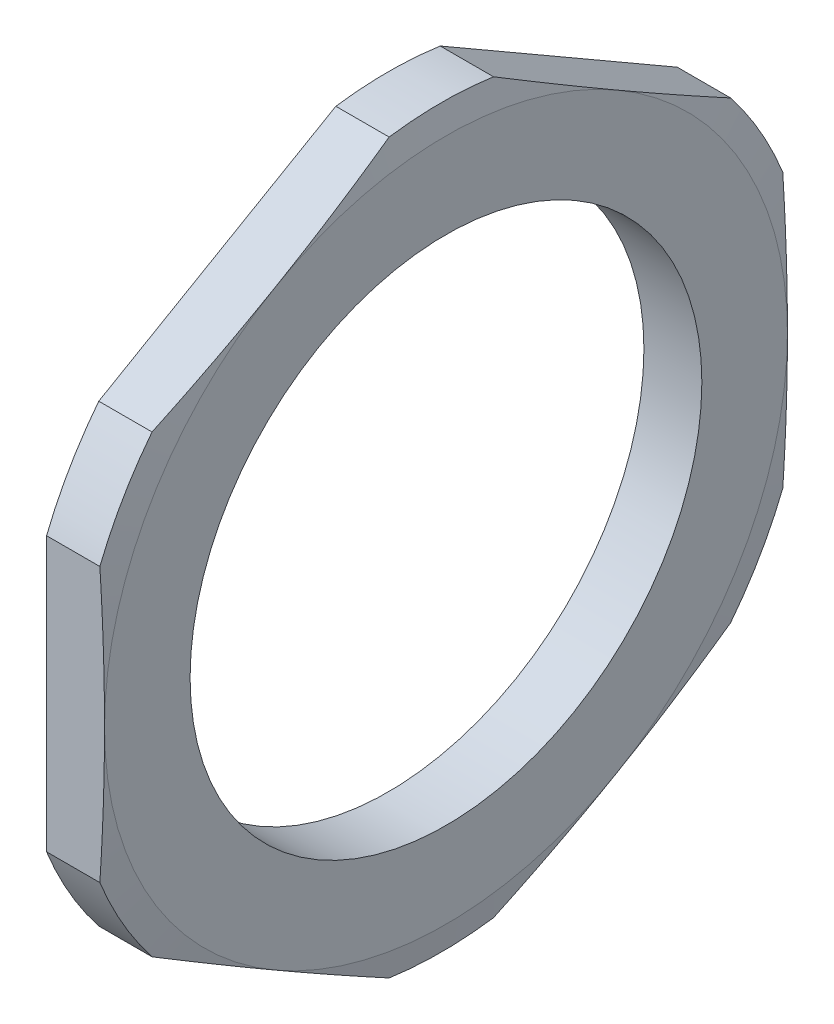
ISO-10303-21;
HEADER;
FILE_DESCRIPTION(('STEP AP214'),'2;1');
FILE_NAME('part.step','',(''),(''),'','','');
FILE_SCHEMA(('AUTOMOTIVE_DESIGN { 1 0 10303 214 1 1 1 1 }'));
ENDSEC;
DATA;
#1=APPLICATION_CONTEXT('core data for automotive mechanical design processes');
#2=APPLICATION_PROTOCOL_DEFINITION('international standard','automotive_design',2000,#1);
#3=PRODUCT_CONTEXT('',#1,'mechanical');
#4=PRODUCT('Part','Part','',(#3));
#5=PRODUCT_RELATED_PRODUCT_CATEGORY('part','',(#4));
#6=PRODUCT_DEFINITION_FORMATION('','',#4);
#7=PRODUCT_DEFINITION_CONTEXT('part definition',#1,'design');
#8=PRODUCT_DEFINITION('design','',#6,#7);
#9=PRODUCT_DEFINITION_SHAPE('','',#8);
#10=(LENGTH_UNIT() NAMED_UNIT(*) SI_UNIT(.MILLI.,.METRE.));
#11=(NAMED_UNIT(*) PLANE_ANGLE_UNIT() SI_UNIT($,.RADIAN.));
#12=(NAMED_UNIT(*) SI_UNIT($,.STERADIAN.) SOLID_ANGLE_UNIT());
#13=UNCERTAINTY_MEASURE_WITH_UNIT(LENGTH_MEASURE(1.E-05),#10,'distance_accuracy_value','');
#14=(GEOMETRIC_REPRESENTATION_CONTEXT(3) GLOBAL_UNCERTAINTY_ASSIGNED_CONTEXT((#13)) GLOBAL_UNIT_ASSIGNED_CONTEXT((#10,
#11,#12)) REPRESENTATION_CONTEXT('',''));
#15=CARTESIAN_POINT('',(0.,0.,0.));
#16=DIRECTION('',(0.,0.,1.));
#17=DIRECTION('',(1.,0.,0.));
#18=AXIS2_PLACEMENT_3D('',#15,#16,#17);
#19=CARTESIAN_POINT('',(-2.0638039756129,0.,0.));
#20=DIRECTION('',(-1.,0.,0.));
#21=DIRECTION('',(0.,0.,1.));
#22=AXIS2_PLACEMENT_3D('',#19,#20,#21);
#23=CONICAL_SURFACE('',#22,22.575874890868,1.39626340159553);
#24=CARTESIAN_POINT('',(-1.77800000000007,0.,0.));
#25=DIRECTION('',(-1.,0.,0.));
#26=DIRECTION('',(0.,0.,1.));
#27=AXIS2_PLACEMENT_3D('',#24,#25,#26);
#28=CIRCLE('',#27,20.9549999999998);
#29=CARTESIAN_POINT('',(-1.77800029008495,18.1476212699883,-10.477397232584));
#30=VERTEX_POINT('',#29);
#31=CARTESIAN_POINT('',(-1.77800029006346,18.147502896444,10.4776022616274));
#32=VERTEX_POINT('',#31);
#33=EDGE_CURVE('E128',#30,#32,#28,.F.);
#34=ORIENTED_EDGE('',*,*,#33,.F.);
#35=CARTESIAN_POINT('',(-1.77800029008495,18.1476212699883,-10.477397232584));
#36=CARTESIAN_POINT('',(-1.7779970080575,18.3227772175417,-10.1740186685898));
#37=CARTESIAN_POINT('',(-1.77954993025203,18.4979320650045,-9.87064175862999));
#38=CARTESIAN_POINT('',(-1.78573957365674,18.8482275355357,-9.26391234565797));
#39=CARTESIAN_POINT('',(-1.79037628566044,19.0233681586449,-8.96055984257561));
#40=CARTESIAN_POINT('',(-1.80886574614676,19.5486539143325,-8.05073815193656));
#41=CARTESIAN_POINT('',(-1.82729784985843,19.8987612712438,-7.44433445656199));
#42=CARTESIAN_POINT('',(-1.87583943314026,20.5987586729663,-6.23190341953186));
#43=CARTESIAN_POINT('',(-1.90594857847046,20.9486487237105,-5.62587606760123));
#44=CARTESIAN_POINT('',(-1.97698154877059,21.648251056497,-4.41412926815799));
#45=CARTESIAN_POINT('',(-2.01790832076893,21.9979632640385,-3.80840994968449));
#46=CARTESIAN_POINT('',(-2.06380397707091,22.3475058615623,-3.20298442533075));
#47=B_SPLINE_CURVE_WITH_KNOTS('',3,(#35,#36,#37,#38,#39,#40,#41,#42,#43,#44,#45,#46),
.UNSPECIFIED.,.F.,.F.,(4,2,2,2,2,4),(0.,1.0509272477156,2.10185135796125,4.20310963280431,
6.30430776632957,8.40607891688846),.UNSPECIFIED.);
#48=CARTESIAN_POINT('',(-2.06380397649756,22.3475058571927,-3.20298443289923));
#49=VERTEX_POINT('',#48);
#50=EDGE_CURVE('E135',#30,#49,#47,.T.);
#51=ORIENTED_EDGE('',*,*,#50,.T.);
#52=CARTESIAN_POINT('',(-2.06380397561302,0.,0.));
#53=DIRECTION('',(-1.,0.,0.));
#54=DIRECTION('',(0.,0.,1.));
#55=AXIS2_PLACEMENT_3D('',#52,#53,#54);
#56=CIRCLE('',#55,22.5758748908686);
#57=CARTESIAN_POINT('',(-2.06380397694134,22.3475058605748,3.20298442704117));
#58=VERTEX_POINT('',#57);
#59=EDGE_CURVE('E375',#58,#49,#56,.T.);
#60=ORIENTED_EDGE('',*,*,#59,.F.);
#61=CARTESIAN_POINT('',(-2.0638041369402,22.3475057034708,3.20298432497833));
#62=CARTESIAN_POINT('',(-2.01790707679827,21.9979533719432,3.80842696310606));
#63=CARTESIAN_POINT('',(-1.97697925398998,21.6482313481162,4.41416337516071));
#64=CARTESIAN_POINT('',(-1.90594487004642,20.9486093219883,5.62594434229224));
#65=CARTESIAN_POINT('',(-1.87583536151912,20.5987093942114,6.23198876832364));
#66=CARTESIAN_POINT('',(-1.82729371945734,19.8986922646491,7.44445398400546));
#67=CARTESIAN_POINT('',(-1.80886192017177,19.5485750569317,8.05087478393152));
#68=CARTESIAN_POINT('',(-1.79037351361935,19.023274464875,8.96072210145369));
#69=CARTESIAN_POINT('',(-1.78573725258085,18.8481288841181,9.26408314557334));
#70=CARTESIAN_POINT('',(-1.77954859282133,18.4978236003233,9.87082969432088));
#71=CARTESIAN_POINT('',(-1.77799620330407,18.3226638972449,10.1742151990191));
#72=CARTESIAN_POINT('',(-1.77800000005894,18.1475032052677,10.4776024179572));
#73=B_SPLINE_CURVE_WITH_KNOTS('',3,(#61,#62,#63,#64,#65,#66,#67,#68,#69,#70,#71,#72),
.UNSPECIFIED.,.F.,.F.,(4,2,2,2,2,4),(0.,2.10183036071096,4.20308765396243,6.30440508839504,
7.35535880432361,8.40631565680275),.UNSPECIFIED.);
#74=EDGE_CURVE('E151',#58,#32,#73,.T.);
#75=ORIENTED_EDGE('',*,*,#74,.T.);
#76=EDGE_LOOP('',(#34,#51,#60,#75));
#77=FACE_BOUND('',#76,.T.);
#78=ADVANCED_FACE('F17',(#77),#23,.T.);
#79=CARTESIAN_POINT('',(-2.0638039756129,0.,0.));
#80=DIRECTION('',(-1.,0.,0.));
#81=DIRECTION('',(0.,0.,1.));
#82=AXIS2_PLACEMENT_3D('',#79,#80,#81);
#83=CONICAL_SURFACE('',#82,22.575874890868,1.39626340159543);
#84=CARTESIAN_POINT('',(-1.7779999999999,0.,0.));
#85=DIRECTION('',(-1.,0.,0.));
#86=DIRECTION('',(0.,0.,1.));
#87=AXIS2_PLACEMENT_3D('',#84,#85,#86);
#88=CIRCLE('',#87,20.9549999999998);
#89=CARTESIAN_POINT('',(-1.7780006980624,-1.16367721638641E-05,20.9550001089025));
#90=VERTEX_POINT('',#89);
#91=EDGE_CURVE('E153',#32,#90,#88,.F.);
#92=ORIENTED_EDGE('',*,*,#91,.F.);
#93=CARTESIAN_POINT('',(-1.77800029006346,18.147502896444,10.4776022616274));
#94=CARTESIAN_POINT('',(-1.77799700750391,17.972347322969,10.7809810504992));
#95=CARTESIAN_POINT('',(-1.77954992922748,17.7971926318913,11.0843580596542));
#96=CARTESIAN_POINT('',(-1.78573957182262,17.4468972745811,11.69108755581));
#97=CARTESIAN_POINT('',(-1.79037628348771,17.2717566083083,11.9944400428813));
#98=CARTESIAN_POINT('',(-1.80886574317165,16.746470777579,12.90426171691));
#99=CARTESIAN_POINT('',(-1.82729784663273,16.3963634431795,13.5106654430893));
#100=CARTESIAN_POINT('',(-1.87583942995868,15.6963660502194,14.7230965207792));
#101=CARTESIAN_POINT('',(-1.90594857558355,15.346475985727,15.3291238825654));
#102=CARTESIAN_POINT('',(-1.9769815469686,14.6468736254429,16.5408707017103));
#103=CARTESIAN_POINT('',(-2.01790831975748,14.2971614041521,17.1465900300297));
#104=CARTESIAN_POINT('',(-2.06380397707257,13.9476188110308,17.7520155746912));
#105=B_SPLINE_CURVE_WITH_KNOTS('',3,(#93,#94,#95,#96,#97,#98,#99,#100,#101,#102,#103,#104),
.UNSPECIFIED.,.F.,.F.,(4,2,2,2,2,4),(0.,1.05092727084703,2.10185140422412,4.20310972528862,
6.30430790503132,8.4060791018478),.UNSPECIFIED.);
#106=CARTESIAN_POINT('',(-2.06380397649857,13.9476188154055,17.7520155671141));
#107=VERTEX_POINT('',#106);
#108=EDGE_CURVE('E289',#32,#107,#105,.T.);
#109=ORIENTED_EDGE('',*,*,#108,.T.);
#110=CARTESIAN_POINT('',(-2.06380397561302,0.,0.));
#111=DIRECTION('',(-1.,0.,0.));
#112=DIRECTION('',(0.,0.,1.));
#113=AXIS2_PLACEMENT_3D('',#110,#111,#112);
#114=CIRCLE('',#113,22.5758748908686);
#115=CARTESIAN_POINT('',(-2.06380397868554,8.39988707512952,20.955));
#116=VERTEX_POINT('',#115);
#117=EDGE_CURVE('E372',#116,#107,#114,.T.);
#118=ORIENTED_EDGE('',*,*,#117,.F.);
#119=CARTESIAN_POINT('',(-2.06380434877527,8.39988709788332,20.9549995672522));
#120=CARTESIAN_POINT('',(-2.01790773813532,7.70079110040767,20.9549998448419));
#121=CARTESIAN_POINT('',(-1.97698031588961,7.00135584554496,20.954999958484));
#122=CARTESIAN_POINT('',(-1.90594651666459,5.60212948788304,20.9550000415047));
#123=CARTESIAN_POINT('',(-1.87583719242622,4.90233853409656,20.9550000109225));
#124=CARTESIAN_POINT('',(-1.82729558508398,3.50232205822875,20.9549999890772));
#125=CARTESIAN_POINT('',(-1.80886363619597,2.80209652428347,20.9549999978151));
#126=CARTESIAN_POINT('',(-1.79037476637717,1.75150867103101,20.9550000010928));
#127=CARTESIAN_POINT('',(-1.78573831106224,1.40122195645802,20.9550000005464));
#128=CARTESIAN_POINT('',(-1.77954918242668,0.700620280958181,20.9549999994536));
#129=CARTESIAN_POINT('',(-1.7779965183105,0.350305319950141,20.9549999989072));
#130=CARTESIAN_POINT('',(-1.7780000000005,-1.16213678839792E-05,20.955));
#131=B_SPLINE_CURVE_WITH_KNOTS('',3,(#119,#120,#121,#122,#123,#124,#125,#126,#127,#128,#129,
#130),.UNSPECIFIED.,.F.,.F.,(4,2,2,2,2,4),(0.,2.101803706045,4.20303436629864,6.30432516274332,
7.35526554838715,8.40620907085267),.UNSPECIFIED.);
#132=EDGE_CURVE('E288',#116,#90,#131,.T.);
#133=ORIENTED_EDGE('',*,*,#132,.T.);
#134=EDGE_LOOP('',(#92,#109,#118,#133));
#135=FACE_BOUND('',#134,.T.);
#136=ADVANCED_FACE('F246',(#135),#83,.T.);
#137=CARTESIAN_POINT('',(-2.0638039756129,0.,0.));
#138=DIRECTION('',(-1.,0.,0.));
#139=DIRECTION('',(0.,0.,1.));
#140=AXIS2_PLACEMENT_3D('',#137,#138,#139);
#141=CONICAL_SURFACE('',#140,22.575874890868,1.39626340159544);
#142=CARTESIAN_POINT('',(-1.77799999999991,0.,0.));
#143=DIRECTION('',(-1.,0.,0.));
#144=DIRECTION('',(0.,0.,1.));
#145=AXIS2_PLACEMENT_3D('',#142,#143,#144);
#146=CIRCLE('',#145,20.9549999999998);
#147=CARTESIAN_POINT('',(-1.77800000045612,-18.1473976949118,10.4777851672545));
#148=VERTEX_POINT('',#147);
#149=EDGE_CURVE('E154',#90,#148,#146,.F.);
#150=ORIENTED_EDGE('',*,*,#149,.F.);
#151=CARTESIAN_POINT('',(-1.77800023479884,-1.1636772209226E-05,20.9549997201782));
#152=CARTESIAN_POINT('',(-1.7779966725517,-0.350327608074779,20.9549998968345));
#153=CARTESIAN_POINT('',(-1.77954933421647,-0.700641598318654,20.9549999717357));
#154=CARTESIAN_POINT('',(-1.78573851866786,-1.40124133142155,20.9550000282642));
#155=CARTESIAN_POINT('',(-1.7903750322485,-1.75152707436178,20.9550000098916));
#156=CARTESIAN_POINT('',(-1.80886402470487,-2.80211201469421,20.9549999802223));
#157=CARTESIAN_POINT('',(-1.82729598586696,-3.50233560744828,20.9549999943492));
#158=CARTESIAN_POINT('',(-1.87583759645448,-4.90234819802903,20.9550000056506));
#159=CARTESIAN_POINT('',(-1.90594691162541,-5.60213720772105,20.9550000028257));
#160=CARTESIAN_POINT('',(-1.9769805079014,-7.00135968503903,20.9549999971735));
#161=CARTESIAN_POINT('',(-2.01790773619289,-7.70079300365607,20.9549999943463));
#162=CARTESIAN_POINT('',(-2.06380397867771,-8.39988707501032,20.955));
#163=B_SPLINE_CURVE_WITH_KNOTS('',3,(#151,#152,#153,#154,#155,#156,#157,#158,#159,#160,#161,
#162),.UNSPECIFIED.,.F.,.F.,(4,2,2,2,2,4),(0.,1.05094061034846,2.10187808341904,
4.20316306036174,6.30438789421651,8.40618576794868),.UNSPECIFIED.);
#164=CARTESIAN_POINT('',(-2.06380397747245,-8.39988705663915,20.955));
#165=VERTEX_POINT('',#164);
#166=EDGE_CURVE('E264',#90,#165,#163,.T.);
#167=ORIENTED_EDGE('',*,*,#166,.T.);
#168=CARTESIAN_POINT('',(-2.06380397561302,0.,0.));
#169=DIRECTION('',(-1.,0.,0.));
#170=DIRECTION('',(0.,0.,1.));
#171=AXIS2_PLACEMENT_3D('',#168,#169,#170);
#172=CIRCLE('',#171,22.5758748908686);
#173=CARTESIAN_POINT('',(-2.06380397694134,-13.947618812031,17.7520155729588));
#174=VERTEX_POINT('',#173);
#175=EDGE_CURVE('E263',#174,#165,#172,.T.);
#176=ORIENTED_EDGE('',*,*,#175,.F.);
#177=CARTESIAN_POINT('',(-2.0638041369402,-13.94761864509,17.7520154879342));
#178=CARTESIAN_POINT('',(-2.01790952678104,-14.2971525706028,17.1466052099948));
#179=CARTESIAN_POINT('',(-1.9769836169186,-14.6468560466453,16.5409011201662));
#180=CARTESIAN_POINT('',(-1.90595185837015,-15.3464408596969,15.329184751541));
#181=CARTESIAN_POINT('',(-1.87584306296393,-15.696322122227,14.7231726017796));
#182=CARTESIAN_POINT('',(-1.82730152482232,-16.3963019355719,13.5107719819052));
#183=CARTESIAN_POINT('',(-1.8088691162582,-16.7464004923183,12.904383501519));
#184=CARTESIAN_POINT('',(-1.79037877311789,-17.271673096825,11.9945846655236));
#185=CARTESIAN_POINT('',(-1.78574169591962,-17.4468093423538,11.6912397895484));
#186=CARTESIAN_POINT('',(-1.77955106660383,-17.7970959592255,11.0845255709703));
#187=CARTESIAN_POINT('',(-1.77799752368892,-17.972246330609,10.7811562282971));
#188=CARTESIAN_POINT('',(-1.77800000045612,-18.1473976949118,10.4777851672545));
#189=B_SPLINE_CURVE_WITH_KNOTS('',3,(#177,#178,#179,#180,#181,#182,#183,#184,#185,#186,#187,
#188),.UNSPECIFIED.,.F.,.F.,(4,2,2,2,2,4),(0.,2.10171843482959,4.20286389980033,
6.30406949559169,7.3549672418683,8.40586812448028),.UNSPECIFIED.);
#190=EDGE_CURVE('E258',#174,#148,#189,.T.);
#191=ORIENTED_EDGE('',*,*,#190,.T.);
#192=EDGE_LOOP('',(#150,#167,#176,#191));
#193=FACE_BOUND('',#192,.T.);
#194=ADVANCED_FACE('F241',(#193),#141,.T.);
#195=CARTESIAN_POINT('',(-2.0638039756129,0.,0.));
#196=DIRECTION('',(-1.,0.,0.));
#197=DIRECTION('',(0.,0.,1.));
#198=AXIS2_PLACEMENT_3D('',#195,#196,#197);
#199=CONICAL_SURFACE('',#198,22.575874890868,1.39626340159553);
#200=CARTESIAN_POINT('',(-1.77800000000007,0.,0.));
#201=DIRECTION('',(-1.,0.,0.));
#202=DIRECTION('',(0.,0.,1.));
#203=AXIS2_PLACEMENT_3D('',#200,#201,#202);
#204=CIRCLE('',#203,20.9549999999998);
#205=CARTESIAN_POINT('',(-1.77800033483411,-18.1473973116968,-10.4777850340109));
#206=VERTEX_POINT('',#205);
#207=EDGE_CURVE('E162',#148,#206,#204,.F.);
#208=ORIENTED_EDGE('',*,*,#207,.F.);
#209=CARTESIAN_POINT('',(-1.77800014157669,-18.1473975538922,10.477785075146));
#210=CARTESIAN_POINT('',(-1.77799563292562,-18.3225627365479,10.1743902914201));
#211=CARTESIAN_POINT('',(-1.77954744101002,-18.4977268779135,9.87099718894615));
#212=CARTESIAN_POINT('',(-1.78573514394699,-18.8480409912325,9.26423541401961));
#213=CARTESIAN_POINT('',(-1.790371029594,-19.0231909632265,8.9608667414968));
#214=CARTESIAN_POINT('',(-1.80885853668179,-19.5485047373202,8.0509965591866));
#215=CARTESIAN_POINT('',(-1.82729003826778,-19.8986307520898,7.44456052953534));
#216=CARTESIAN_POINT('',(-1.87583173139064,-20.5986654640008,6.23206485502871));
#217=CARTESIAN_POINT('',(-1.90594158862067,-20.9485741670758,5.62600519989655));
#218=CARTESIAN_POINT('',(-1.97697718242628,-21.6482137948651,4.41419381078261));
#219=CARTESIAN_POINT('',(-2.01790586669608,-21.9979446450631,3.80844220586693));
#220=CARTESIAN_POINT('',(-2.06380397707089,-22.3475058615622,3.202984425331));
#221=B_SPLINE_CURVE_WITH_KNOTS('',3,(#209,#210,#211,#212,#213,#214,#215,#216,#217,#218,#219,
#220),.UNSPECIFIED.,.F.,.F.,(4,2,2,2,2,4),(0.,1.05098324063376,2.10196334423883,
4.20333350639099,6.30464351875737,8.40652664456987),.UNSPECIFIED.);
#222=CARTESIAN_POINT('',(-2.06380397649756,-22.3475058571927,3.20298443289923));
#223=VERTEX_POINT('',#222);
#224=EDGE_CURVE('E232',#148,#223,#221,.T.);
#225=ORIENTED_EDGE('',*,*,#224,.T.);
#226=CARTESIAN_POINT('',(-2.06380397561302,0.,0.));
#227=DIRECTION('',(-1.,0.,0.));
#228=DIRECTION('',(0.,0.,1.));
#229=AXIS2_PLACEMENT_3D('',#226,#227,#228);
#230=CIRCLE('',#229,22.5758748908686);
#231=CARTESIAN_POINT('',(-2.06380397694134,-22.3475058605748,-3.20298442704116));
#232=VERTEX_POINT('',#231);
#233=EDGE_CURVE('E231',#232,#223,#230,.T.);
#234=ORIENTED_EDGE('',*,*,#233,.F.);
#235=CARTESIAN_POINT('',(-2.0638041369402,-22.3475057034708,-3.20298432497832));
#236=CARTESIAN_POINT('',(-2.01790592131556,-21.997944593105,-3.80844216849988));
#237=CARTESIAN_POINT('',(-1.9769771963172,-21.6482137814764,-4.41419380147339));
#238=CARTESIAN_POINT('',(-1.90594157420674,-20.9485741752738,-5.62600521818742));
#239=CARTESIAN_POINT('',(-1.87583172938572,-20.5986654552313,-6.2320648728696));
#240=CARTESIAN_POINT('',(-1.82729003840933,-19.8986307339851,-7.44456055824174));
#241=CARTESIAN_POINT('',(-1.80885852653948,-19.5485047268489,-8.05099659920823));
#242=CARTESIAN_POINT('',(-1.7903710334504,-19.0231909339038,-8.96086678133976));
#243=CARTESIAN_POINT('',(-1.78573515737712,-18.8480409505787,-9.26423545093134));
#244=CARTESIAN_POINT('',(-1.77954742660412,-18.497726863314,-9.87099724773596));
#245=CARTESIAN_POINT('',(-1.77799558110872,-18.322562759334,-10.1743903750193));
#246=CARTESIAN_POINT('',(-1.77800000045643,-18.1473976677729,-10.4777852142605));
#247=B_SPLINE_CURVE_WITH_KNOTS('',3,(#235,#236,#237,#238,#239,#240,#241,#242,#243,#244,#245,
#246),.UNSPECIFIED.,.F.,.F.,(4,2,2,2,2,4),(0.,2.10188314816874,4.2031931828428,6.3045633635846,
7.35554347640753,8.40652672588245),.UNSPECIFIED.);
#248=EDGE_CURVE('E225',#232,#206,#247,.T.);
#249=ORIENTED_EDGE('',*,*,#248,.T.);
#250=EDGE_LOOP('',(#208,#225,#234,#249));
#251=FACE_BOUND('',#250,.T.);
#252=ADVANCED_FACE('F237',(#251),#199,.T.);
#253=CARTESIAN_POINT('',(-2.0638039756129,0.,0.));
#254=DIRECTION('',(-1.,0.,0.));
#255=DIRECTION('',(0.,0.,1.));
#256=AXIS2_PLACEMENT_3D('',#253,#254,#255);
#257=CONICAL_SURFACE('',#256,22.575874890868,1.39626340159555);
#258=CARTESIAN_POINT('',(-1.7780000000001,0.,0.));
#259=DIRECTION('',(-1.,0.,0.));
#260=DIRECTION('',(0.,0.,1.));
#261=AXIS2_PLACEMENT_3D('',#258,#259,#260);
#262=CIRCLE('',#261,20.9549999999998);
#263=CARTESIAN_POINT('',(-1.77800000000013,-2.02357626718628E-06,-20.955));
#264=VERTEX_POINT('',#263);
#265=EDGE_CURVE('E121',#206,#264,#262,.F.);
#266=ORIENTED_EDGE('',*,*,#265,.F.);
#267=CARTESIAN_POINT('',(-1.77800033483411,-18.1473973116968,-10.4777850340109));
#268=CARTESIAN_POINT('',(-1.77799764679684,-17.9722461666536,-10.781156219384));
#269=CARTESIAN_POINT('',(-1.77955110061086,-17.7970958887071,-11.0845256130816));
#270=CARTESIAN_POINT('',(-1.78574166312775,-17.4468093441253,-11.6912398665099));
#271=CARTESIAN_POINT('',(-1.79037876262406,-17.2716730774497,-11.9945847263111));
#272=CARTESIAN_POINT('',(-1.80886914034298,-16.7464004429166,-12.9043835326434));
#273=CARTESIAN_POINT('',(-1.82730152890288,-16.3963019103662,-13.5107720189123));
#274=CARTESIAN_POINT('',(-1.87584306139096,-15.696322111276,-14.7231726273975));
#275=CARTESIAN_POINT('',(-1.90595187111253,-15.3464408388046,-15.3291847598886));
#276=CARTESIAN_POINT('',(-1.97698360513767,-14.6468560580439,-16.5409011282696));
#277=CARTESIAN_POINT('',(-2.01790947615498,-14.2971526242479,-17.146605235133));
#278=CARTESIAN_POINT('',(-2.06380397707092,-13.9476188110434,-17.7520155746693));
#279=B_SPLINE_CURVE_WITH_KNOTS('',3,(#267,#268,#269,#270,#271,#272,#273,#274,#275,#276,#277,
#278),.UNSPECIFIED.,.F.,.F.,(4,2,2,2,2,4),(0.,1.05090087387277,2.10179861018149,
4.20300418419584,6.30414962120934,8.40586802963439),.UNSPECIFIED.);
#280=CARTESIAN_POINT('',(-2.06380397649756,-13.9476188154132,-17.7520155671007));
#281=VERTEX_POINT('',#280);
#282=EDGE_CURVE('E220',#206,#281,#279,.T.);
#283=ORIENTED_EDGE('',*,*,#282,.T.);
#284=CARTESIAN_POINT('',(-2.06380397561302,0.,0.));
#285=DIRECTION('',(-1.,0.,0.));
#286=DIRECTION('',(0.,0.,1.));
#287=AXIS2_PLACEMENT_3D('',#284,#285,#286);
#288=CIRCLE('',#287,22.5758748908686);
#289=CARTESIAN_POINT('',(-2.06380397840246,-8.39988707081467,-20.955));
#290=VERTEX_POINT('',#289);
#291=EDGE_CURVE('E358',#290,#281,#288,.T.);
#292=ORIENTED_EDGE('',*,*,#291,.F.);
#293=CARTESIAN_POINT('',(-2.06380431439456,-8.39988709147208,-20.9549996071228));
#294=CARTESIAN_POINT('',(-2.01790781142779,-7.70079239848928,-20.9549998591372));
#295=CARTESIAN_POINT('',(-1.97698046520389,-7.00135845020006,-20.954999962309));
#296=CARTESIAN_POINT('',(-1.90594676463589,-5.60213470692317,-20.9550000376807));
#297=CARTESIAN_POINT('',(-1.87583746306067,-4.90234506094688,-20.9550000099162));
#298=CARTESIAN_POINT('',(-1.82729585773858,-3.50233120144833,-20.9549999900835));
#299=CARTESIAN_POINT('',(-1.80886388820721,-2.80210697606211,-20.9549999980164));
#300=CARTESIAN_POINT('',(-1.79037495079214,-1.75152108599315,-20.9550000009921));
#301=CARTESIAN_POINT('',(-1.78573846683336,-1.40123502618529,-20.955000000496));
#302=CARTESIAN_POINT('',(-1.77954926908308,-0.700634659985505,-20.954999999504));
#303=CARTESIAN_POINT('',(-1.77799656449583,-0.3503203535124,-20.9549999990079));
#304=CARTESIAN_POINT('',(-1.7780000000002,-4.06652600457068E-06,-20.955));
#305=B_SPLINE_CURVE_WITH_KNOTS('',3,(#293,#294,#295,#296,#297,#298,#299,#300,#301,#302,#303,
#304),.UNSPECIFIED.,.F.,.F.,(4,2,2,2,2,4),(0.,2.10179978025262,4.20302651839312,
6.30431339277068,7.35525181550258,8.40619337499631),.UNSPECIFIED.);
#306=EDGE_CURVE('E193',#290,#264,#305,.T.);
#307=ORIENTED_EDGE('',*,*,#306,.T.);
#308=EDGE_LOOP('',(#266,#283,#292,#307));
#309=FACE_BOUND('',#308,.T.);
#310=ADVANCED_FACE('F180',(#309),#257,.T.);
#311=CARTESIAN_POINT('',(-2.0638039756129,0.,0.));
#312=DIRECTION('',(-1.,0.,0.));
#313=DIRECTION('',(0.,0.,1.));
#314=AXIS2_PLACEMENT_3D('',#311,#312,#313);
#315=CONICAL_SURFACE('',#314,22.575874890868,1.39626340159553);
#316=CARTESIAN_POINT('',(-1.77800029529785,-4.04715252431621E-06,-20.9549996480779));
#317=CARTESIAN_POINT('',(-1.77799664859793,0.350312579272597,-20.9549998702524));
#318=CARTESIAN_POINT('',(-1.77954925365824,0.7006272247376,-20.954999964453));
#319=CARTESIAN_POINT('',(-1.78573835690468,1.40122826835212,-20.9550000355469));
#320=CARTESIAN_POINT('',(-1.79037484588394,1.75151466658284,-20.9550000124404));
#321=CARTESIAN_POINT('',(-1.80886377699696,2.80210157161958,-20.9549999751263));
#322=CARTESIAN_POINT('',(-1.82729571385719,3.50232647397435,-20.9549999928932));
#323=CARTESIAN_POINT('',(-1.87583732590279,4.90234168241672,-20.9550000071066));
#324=CARTESIAN_POINT('',(-1.90594666682655,5.6021320003699,-20.9550000035538));
#325=CARTESIAN_POINT('',(-1.97698035668458,7.00135709371289,-20.9549999964452));
#326=CARTESIAN_POINT('',(-2.01790765283143,7.70079172009255,-20.9549999928895));
#327=CARTESIAN_POINT('',(-2.06380398017833,8.3998870978833,-20.955));
#328=B_SPLINE_CURVE_WITH_KNOTS('',3,(#316,#317,#318,#319,#320,#321,#322,#323,#324,#325,#326,
#327),.UNSPECIFIED.,.F.,.F.,(4,2,2,2,2,4),(0.,1.05094257517183,2.10188201279146,
4.20317091477096,6.30439967252767,8.40620147408867),.UNSPECIFIED.);
#329=CARTESIAN_POINT('',(-2.06380397561301,8.39988702829694,-20.955));
#330=VERTEX_POINT('',#329);
#331=EDGE_CURVE('E185',#264,#330,#328,.T.);
#332=ORIENTED_EDGE('',*,*,#331,.T.);
#333=CARTESIAN_POINT('',(-2.06380397561302,0.,0.));
#334=DIRECTION('',(-1.,0.,0.));
#335=DIRECTION('',(0.,0.,1.));
#336=AXIS2_PLACEMENT_3D('',#333,#334,#335);
#337=CIRCLE('',#336,22.5758748908686);
#338=CARTESIAN_POINT('',(-2.06380397694134,13.947618812031,-17.7520155729588));
#339=VERTEX_POINT('',#338);
#340=EDGE_CURVE('E147',#339,#330,#337,.T.);
#341=ORIENTED_EDGE('',*,*,#340,.F.);
#342=CARTESIAN_POINT('',(-2.0638041369402,13.94761864509,-17.7520154879342));
#343=CARTESIAN_POINT('',(-2.01790707578587,14.2971711921708,-17.1465729564928));
#344=CARTESIAN_POINT('',(-1.97697925218711,14.6468933087935,-16.5408365802323));
#345=CARTESIAN_POINT('',(-1.90594486715869,15.3465154124911,-15.3290556223136));
#346=CARTESIAN_POINT('',(-1.87583535833673,15.6964153250713,-14.7230111697179));
#347=CARTESIAN_POINT('',(-1.82729371623206,16.3964324536889,-13.5105459178952));
#348=CARTESIAN_POINT('',(-1.8088619171983,16.7465496756592,-12.904125108393));
#349=CARTESIAN_POINT('',(-1.7903735114462,17.2718502817364,-11.9942777722545));
#350=CARTESIAN_POINT('',(-1.78573725074499,17.4469958659416,-11.6909167212174));
#351=CARTESIAN_POINT('',(-1.77954859179939,17.7973011566314,-11.0841701586376));
#352=CARTESIAN_POINT('',(-1.77799620275877,17.9724608631567,-10.7807846470245));
#353=CARTESIAN_POINT('',(-1.77800000005912,18.1476215598069,-10.4773974218821));
#354=B_SPLINE_CURVE_WITH_KNOTS('',3,(#342,#343,#344,#345,#346,#347,#348,#349,#350,#351,#352,
#353),.UNSPECIFIED.,.F.,.F.,(4,2,2,2,2,4),(0.,2.10183040696177,4.20308774642371,
6.30440522707106,7.35535896612781,8.40631584173521),.UNSPECIFIED.);
#355=EDGE_CURVE('E138',#339,#30,#354,.T.);
#356=ORIENTED_EDGE('',*,*,#355,.T.);
#357=CARTESIAN_POINT('',(-1.77800000000007,0.,0.));
#358=DIRECTION('',(-1.,0.,0.));
#359=DIRECTION('',(0.,0.,1.));
#360=AXIS2_PLACEMENT_3D('',#357,#358,#359);
#361=CIRCLE('',#360,20.9549999999998);
#362=EDGE_CURVE('E21',#264,#30,#361,.F.);
#363=ORIENTED_EDGE('',*,*,#362,.F.);
#364=EDGE_LOOP('',(#332,#341,#356,#363));
#365=FACE_BOUND('',#364,.T.);
#366=ADVANCED_FACE('F146',(#365),#315,.T.);
#367=CARTESIAN_POINT('',(-1.778,0.,0.));
#368=DIRECTION('',(1.,0.,0.));
#369=DIRECTION('',(0.,0.,-1.));
#370=AXIS2_PLACEMENT_3D('',#367,#368,#369);
#371=PLANE('',#370);
#372=CARTESIAN_POINT('',(-1.778,0.,0.));
#373=DIRECTION('',(-1.,0.,0.));
#374=DIRECTION('',(0.,0.,1.));
#375=AXIS2_PLACEMENT_3D('',#372,#373,#374);
#376=CIRCLE('',#375,15.7037028608688);
#377=CARTESIAN_POINT('',(-1.778,0.,15.7037028608688));
#378=VERTEX_POINT('',#377);
#379=EDGE_CURVE('E194',#378,#378,#376,.T.);
#380=ORIENTED_EDGE('',*,*,#379,.T.);
#381=EDGE_LOOP('',(#380));
#382=FACE_BOUND('',#381,.T.);
#383=ORIENTED_EDGE('',*,*,#207,.T.);
#384=ORIENTED_EDGE('',*,*,#265,.T.);
#385=ORIENTED_EDGE('',*,*,#362,.T.);
#386=ORIENTED_EDGE('',*,*,#33,.T.);
#387=ORIENTED_EDGE('',*,*,#91,.T.);
#388=ORIENTED_EDGE('',*,*,#149,.T.);
#389=EDGE_LOOP('',(#383,#384,#385,#386,#387,#388));
#390=FACE_BOUND('',#389,.T.);
#391=ADVANCED_FACE('F125',(#382,#390),#371,.T.);
#392=CARTESIAN_POINT('',(-1.778,0.,0.));
#393=DIRECTION('',(-1.,0.,0.));
#394=DIRECTION('',(0.,0.,1.));
#395=AXIS2_PLACEMENT_3D('',#392,#393,#394);
#396=CYLINDRICAL_SURFACE('',#395,22.5758748908686);
#397=DIRECTION('',(1.,0.,0.));
#398=VECTOR('',#397,1.);
#399=CARTESIAN_POINT('',(-1.778,13.9476188221544,-17.7520155554245));
#400=LINE('',#399,#398);
#401=CARTESIAN_POINT('',(-5.334,13.9476188221544,-17.7520155554245));
#402=VERTEX_POINT('',#401);
#403=EDGE_CURVE('E144',#402,#339,#400,.T.);
#404=ORIENTED_EDGE('',*,*,#403,.T.);
#405=ORIENTED_EDGE('',*,*,#340,.T.);
#406=DIRECTION('',(1.,0.,0.));
#407=VECTOR('',#406,1.);
#408=CARTESIAN_POINT('',(-1.778,8.39988702829695,-20.955));
#409=LINE('',#408,#407);
#410=CARTESIAN_POINT('',(-5.334,8.39988702829694,-20.955));
#411=VERTEX_POINT('',#410);
#412=EDGE_CURVE('E192',#330,#411,#409,.F.);
#413=ORIENTED_EDGE('',*,*,#412,.T.);
#414=CARTESIAN_POINT('',(-5.334,0.,0.));
#415=DIRECTION('',(-1.,0.,0.));
#416=DIRECTION('',(0.,0.,1.));
#417=AXIS2_PLACEMENT_3D('',#414,#415,#416);
#418=CIRCLE('',#417,22.5758748908686);
#419=EDGE_CURVE('E353',#411,#402,#418,.F.);
#420=ORIENTED_EDGE('',*,*,#419,.T.);
#421=EDGE_LOOP('',(#404,#405,#413,#420));
#422=FACE_BOUND('',#421,.T.);
#423=ADVANCED_FACE('F309',(#422),#396,.T.);
#424=CARTESIAN_POINT('',(-1.778,13.9476188221544,-17.7520155554245));
#425=DIRECTION('',(0.,-0.866025403784439,0.5));
#426=DIRECTION('',(0.,-0.5,-0.866025403784439));
#427=AXIS2_PLACEMENT_3D('',#424,#425,#426);
#428=PLANE('',#427);
#429=DIRECTION('',(0.,0.499999999999999,0.866025403784439));
#430=VECTOR('',#429,1.);
#431=CARTESIAN_POINT('',(-5.334,13.9476188221544,-17.7520155554245));
#432=LINE('',#431,#430);
#433=CARTESIAN_POINT('',(-5.334,22.3475058504514,-3.20298444457543));
#434=VERTEX_POINT('',#433);
#435=EDGE_CURVE('E351',#402,#434,#432,.T.);
#436=ORIENTED_EDGE('',*,*,#435,.T.);
#437=DIRECTION('',(-1.,0.,0.));
#438=VECTOR('',#437,1.);
#439=CARTESIAN_POINT('',(-1.778,22.3475058504514,-3.20298444457543));
#440=LINE('',#439,#438);
#441=EDGE_CURVE('E140',#49,#434,#440,.T.);
#442=ORIENTED_EDGE('',*,*,#441,.F.);
#443=ORIENTED_EDGE('',*,*,#50,.F.);
#444=ORIENTED_EDGE('',*,*,#355,.F.);
#445=ORIENTED_EDGE('',*,*,#403,.F.);
#446=EDGE_LOOP('',(#436,#442,#443,#444,#445));
#447=FACE_BOUND('',#446,.T.);
#448=ADVANCED_FACE('F137',(#447),#428,.F.);
#449=CARTESIAN_POINT('',(-1.778,0.,0.));
#450=DIRECTION('',(-1.,0.,0.));
#451=DIRECTION('',(0.,0.,1.));
#452=AXIS2_PLACEMENT_3D('',#449,#450,#451);
#453=CYLINDRICAL_SURFACE('',#452,22.5758748908686);
#454=DIRECTION('',(1.,0.,0.));
#455=VECTOR('',#454,1.);
#456=CARTESIAN_POINT('',(-1.778,22.3475058504514,3.20298444457547));
#457=LINE('',#456,#455);
#458=CARTESIAN_POINT('',(-5.334,22.3475058504514,3.20298444457547));
#459=VERTEX_POINT('',#458);
#460=EDGE_CURVE('E293',#459,#58,#457,.T.);
#461=ORIENTED_EDGE('',*,*,#460,.T.);
#462=ORIENTED_EDGE('',*,*,#59,.T.);
#463=ORIENTED_EDGE('',*,*,#441,.T.);
#464=CARTESIAN_POINT('',(-5.334,0.,0.));
#465=DIRECTION('',(-1.,0.,0.));
#466=DIRECTION('',(0.,0.,1.));
#467=AXIS2_PLACEMENT_3D('',#464,#465,#466);
#468=CIRCLE('',#467,22.5758748908686);
#469=EDGE_CURVE('E350',#434,#459,#468,.F.);
#470=ORIENTED_EDGE('',*,*,#469,.T.);
#471=EDGE_LOOP('',(#461,#462,#463,#470));
#472=FACE_BOUND('',#471,.T.);
#473=ADVANCED_FACE('F300',(#472),#453,.T.);
#474=CARTESIAN_POINT('',(-1.778,22.3475058504514,3.20298444457547));
#475=DIRECTION('',(0.,-0.866025403784438,-0.5));
#476=DIRECTION('',(0.,0.5,-0.866025403784438));
#477=AXIS2_PLACEMENT_3D('',#474,#475,#476);
#478=PLANE('',#477);
#479=DIRECTION('',(0.,-0.5,0.866025403784438));
#480=VECTOR('',#479,1.);
#481=CARTESIAN_POINT('',(-5.334,22.3475058504514,3.20298444457548));
#482=LINE('',#481,#480);
#483=CARTESIAN_POINT('',(-5.334,13.9476188221544,17.7520155554245));
#484=VERTEX_POINT('',#483);
#485=EDGE_CURVE('E347',#459,#484,#482,.T.);
#486=ORIENTED_EDGE('',*,*,#485,.T.);
#487=DIRECTION('',(-1.,0.,0.));
#488=VECTOR('',#487,1.);
#489=CARTESIAN_POINT('',(-1.778,13.9476188221544,17.7520155554245));
#490=LINE('',#489,#488);
#491=EDGE_CURVE('E370',#107,#484,#490,.T.);
#492=ORIENTED_EDGE('',*,*,#491,.F.);
#493=ORIENTED_EDGE('',*,*,#108,.F.);
#494=ORIENTED_EDGE('',*,*,#74,.F.);
#495=ORIENTED_EDGE('',*,*,#460,.F.);
#496=EDGE_LOOP('',(#486,#492,#493,#494,#495));
#497=FACE_BOUND('',#496,.T.);
#498=ADVANCED_FACE('F297',(#497),#478,.F.);
#499=CARTESIAN_POINT('',(-1.778,0.,0.));
#500=DIRECTION('',(-1.,0.,0.));
#501=DIRECTION('',(0.,0.,1.));
#502=AXIS2_PLACEMENT_3D('',#499,#500,#501);
#503=CYLINDRICAL_SURFACE('',#502,22.5758748908686);
#504=DIRECTION('',(-1.,0.,0.));
#505=VECTOR('',#504,1.);
#506=CARTESIAN_POINT('',(-1.778,8.39988702829696,20.955));
#507=LINE('',#506,#505);
#508=CARTESIAN_POINT('',(-5.334,8.39988702829695,20.955));
#509=VERTEX_POINT('',#508);
#510=EDGE_CURVE('E367',#509,#116,#507,.F.);
#511=ORIENTED_EDGE('',*,*,#510,.T.);
#512=ORIENTED_EDGE('',*,*,#117,.T.);
#513=ORIENTED_EDGE('',*,*,#491,.T.);
#514=CARTESIAN_POINT('',(-5.334,0.,0.));
#515=DIRECTION('',(-1.,0.,0.));
#516=DIRECTION('',(0.,0.,1.));
#517=AXIS2_PLACEMENT_3D('',#514,#515,#516);
#518=CIRCLE('',#517,22.5758748908686);
#519=EDGE_CURVE('E346',#484,#509,#518,.F.);
#520=ORIENTED_EDGE('',*,*,#519,.T.);
#521=EDGE_LOOP('',(#511,#512,#513,#520));
#522=FACE_BOUND('',#521,.T.);
#523=ADVANCED_FACE('F278',(#522),#503,.T.);
#524=CARTESIAN_POINT('',(-1.778,8.39988702829696,20.955));
#525=DIRECTION('',(0.,0.,-1.));
#526=DIRECTION('',(-1.,0.,0.));
#527=AXIS2_PLACEMENT_3D('',#524,#525,#526);
#528=PLANE('',#527);
#529=DIRECTION('',(0.,1.,0.));
#530=VECTOR('',#529,1.);
#531=CARTESIAN_POINT('',(-5.334,0.,20.955));
#532=LINE('',#531,#530);
#533=CARTESIAN_POINT('',(-5.334,-8.39988702829697,20.955));
#534=VERTEX_POINT('',#533);
#535=EDGE_CURVE('E343',#509,#534,#532,.F.);
#536=ORIENTED_EDGE('',*,*,#535,.T.);
#537=DIRECTION('',(-1.,0.,0.));
#538=VECTOR('',#537,1.);
#539=CARTESIAN_POINT('',(-1.778,-8.39988702829697,20.955));
#540=LINE('',#539,#538);
#541=EDGE_CURVE('E365',#165,#534,#540,.T.);
#542=ORIENTED_EDGE('',*,*,#541,.F.);
#543=ORIENTED_EDGE('',*,*,#166,.F.);
#544=ORIENTED_EDGE('',*,*,#132,.F.);
#545=ORIENTED_EDGE('',*,*,#510,.F.);
#546=EDGE_LOOP('',(#536,#542,#543,#544,#545));
#547=FACE_BOUND('',#546,.T.);
#548=ADVANCED_FACE('F273',(#547),#528,.F.);
#549=CARTESIAN_POINT('',(-1.778,0.,0.));
#550=DIRECTION('',(-1.,0.,0.));
#551=DIRECTION('',(0.,0.,1.));
#552=AXIS2_PLACEMENT_3D('',#549,#550,#551);
#553=CYLINDRICAL_SURFACE('',#552,22.5758748908686);
#554=DIRECTION('',(1.,0.,0.));
#555=VECTOR('',#554,1.);
#556=CARTESIAN_POINT('',(-1.778,-13.9476188221544,17.7520155554245));
#557=LINE('',#556,#555);
#558=CARTESIAN_POINT('',(-5.334,-13.9476188221544,17.7520155554245));
#559=VERTEX_POINT('',#558);
#560=EDGE_CURVE('E362',#559,#174,#557,.T.);
#561=ORIENTED_EDGE('',*,*,#560,.T.);
#562=ORIENTED_EDGE('',*,*,#175,.T.);
#563=ORIENTED_EDGE('',*,*,#541,.T.);
#564=CARTESIAN_POINT('',(-5.334,0.,0.));
#565=DIRECTION('',(-1.,0.,0.));
#566=DIRECTION('',(0.,0.,1.));
#567=AXIS2_PLACEMENT_3D('',#564,#565,#566);
#568=CIRCLE('',#567,22.5758748908686);
#569=EDGE_CURVE('E342',#534,#559,#568,.F.);
#570=ORIENTED_EDGE('',*,*,#569,.T.);
#571=EDGE_LOOP('',(#561,#562,#563,#570));
#572=FACE_BOUND('',#571,.T.);
#573=ADVANCED_FACE('F269',(#572),#553,.T.);
#574=CARTESIAN_POINT('',(-1.778,-13.9476188221544,17.7520155554245));
#575=DIRECTION('',(0.,0.866025403784439,-0.5));
#576=DIRECTION('',(0.,0.5,0.866025403784439));
#577=AXIS2_PLACEMENT_3D('',#574,#575,#576);
#578=PLANE('',#577);
#579=DIRECTION('',(0.,-0.499999999999999,-0.866025403784439));
#580=VECTOR('',#579,1.);
#581=CARTESIAN_POINT('',(-5.334,-13.9476188221544,17.7520155554245));
#582=LINE('',#581,#580);
#583=CARTESIAN_POINT('',(-5.334,-22.3475058504514,3.20298444457543));
#584=VERTEX_POINT('',#583);
#585=EDGE_CURVE('E336',#559,#584,#582,.T.);
#586=ORIENTED_EDGE('',*,*,#585,.T.);
#587=DIRECTION('',(-1.,0.,0.));
#588=VECTOR('',#587,1.);
#589=CARTESIAN_POINT('',(-1.778,-22.3475058504514,3.20298444457543));
#590=LINE('',#589,#588);
#591=EDGE_CURVE('E360',#223,#584,#590,.T.);
#592=ORIENTED_EDGE('',*,*,#591,.F.);
#593=ORIENTED_EDGE('',*,*,#224,.F.);
#594=ORIENTED_EDGE('',*,*,#190,.F.);
#595=ORIENTED_EDGE('',*,*,#560,.F.);
#596=EDGE_LOOP('',(#586,#592,#593,#594,#595));
#597=FACE_BOUND('',#596,.T.);
#598=ADVANCED_FACE('F265',(#597),#578,.F.);
#599=CARTESIAN_POINT('',(-1.778,0.,0.));
#600=DIRECTION('',(-1.,0.,0.));
#601=DIRECTION('',(0.,0.,1.));
#602=AXIS2_PLACEMENT_3D('',#599,#600,#601);
#603=CYLINDRICAL_SURFACE('',#602,22.5758748908686);
#604=DIRECTION('',(1.,0.,0.));
#605=VECTOR('',#604,1.);
#606=CARTESIAN_POINT('',(-1.778,-22.3475058504514,-3.20298444457546));
#607=LINE('',#606,#605);
#608=CARTESIAN_POINT('',(-5.334,-22.3475058504514,-3.20298444457546));
#609=VERTEX_POINT('',#608);
#610=EDGE_CURVE('E333',#609,#232,#607,.T.);
#611=ORIENTED_EDGE('',*,*,#610,.T.);
#612=ORIENTED_EDGE('',*,*,#233,.T.);
#613=ORIENTED_EDGE('',*,*,#591,.T.);
#614=CARTESIAN_POINT('',(-5.334,0.,0.));
#615=DIRECTION('',(-1.,0.,0.));
#616=DIRECTION('',(0.,0.,1.));
#617=AXIS2_PLACEMENT_3D('',#614,#615,#616);
#618=CIRCLE('',#617,22.5758748908686);
#619=EDGE_CURVE('E334',#584,#609,#618,.F.);
#620=ORIENTED_EDGE('',*,*,#619,.T.);
#621=EDGE_LOOP('',(#611,#612,#613,#620));
#622=FACE_BOUND('',#621,.T.);
#623=ADVANCED_FACE('F216',(#622),#603,.T.);
#624=CARTESIAN_POINT('',(-1.778,-22.3475058504514,-3.20298444457546));
#625=DIRECTION('',(0.,0.866025403784439,0.5));
#626=DIRECTION('',(0.,-0.5,0.866025403784439));
#627=AXIS2_PLACEMENT_3D('',#624,#625,#626);
#628=PLANE('',#627);
#629=DIRECTION('',(0.,0.5,-0.866025403784439));
#630=VECTOR('',#629,1.);
#631=CARTESIAN_POINT('',(-5.334,-22.3475058504514,-3.20298444457546));
#632=LINE('',#631,#630);
#633=CARTESIAN_POINT('',(-5.334,-13.9476188221544,-17.7520155554245));
#634=VERTEX_POINT('',#633);
#635=EDGE_CURVE('E326',#609,#634,#632,.T.);
#636=ORIENTED_EDGE('',*,*,#635,.T.);
#637=DIRECTION('',(-1.,0.,0.));
#638=VECTOR('',#637,1.);
#639=CARTESIAN_POINT('',(-1.778,-13.9476188221544,-17.7520155554245));
#640=LINE('',#639,#638);
#641=EDGE_CURVE('E331',#281,#634,#640,.T.);
#642=ORIENTED_EDGE('',*,*,#641,.F.);
#643=ORIENTED_EDGE('',*,*,#282,.F.);
#644=ORIENTED_EDGE('',*,*,#248,.F.);
#645=ORIENTED_EDGE('',*,*,#610,.F.);
#646=EDGE_LOOP('',(#636,#642,#643,#644,#645));
#647=FACE_BOUND('',#646,.T.);
#648=ADVANCED_FACE('F211',(#647),#628,.F.);
#649=CARTESIAN_POINT('',(-1.778,0.,0.));
#650=DIRECTION('',(-1.,0.,0.));
#651=DIRECTION('',(0.,0.,1.));
#652=AXIS2_PLACEMENT_3D('',#649,#650,#651);
#653=CYLINDRICAL_SURFACE('',#652,22.5758748908686);
#654=DIRECTION('',(1.,0.,0.));
#655=VECTOR('',#654,1.);
#656=CARTESIAN_POINT('',(-1.778,-8.39988702829695,-20.955));
#657=LINE('',#656,#655);
#658=CARTESIAN_POINT('',(-5.334,-8.39988702829694,-20.955));
#659=VERTEX_POINT('',#658);
#660=EDGE_CURVE('E36',#659,#290,#657,.T.);
#661=ORIENTED_EDGE('',*,*,#660,.T.);
#662=ORIENTED_EDGE('',*,*,#291,.T.);
#663=ORIENTED_EDGE('',*,*,#641,.T.);
#664=CARTESIAN_POINT('',(-5.334,0.,0.));
#665=DIRECTION('',(-1.,0.,0.));
#666=DIRECTION('',(0.,0.,1.));
#667=AXIS2_PLACEMENT_3D('',#664,#665,#666);
#668=CIRCLE('',#667,22.5758748908686);
#669=EDGE_CURVE('E323',#634,#659,#668,.F.);
#670=ORIENTED_EDGE('',*,*,#669,.T.);
#671=EDGE_LOOP('',(#661,#662,#663,#670));
#672=FACE_BOUND('',#671,.T.);
#673=ADVANCED_FACE('F206',(#672),#653,.T.);
#674=CARTESIAN_POINT('',(-1.778,-8.39988702829695,-20.955));
#675=DIRECTION('',(0.,0.,1.));
#676=DIRECTION('',(1.,0.,0.));
#677=AXIS2_PLACEMENT_3D('',#674,#675,#676);
#678=PLANE('',#677);
#679=DIRECTION('',(0.,1.,0.));
#680=VECTOR('',#679,1.);
#681=CARTESIAN_POINT('',(-5.334,0.,-20.955));
#682=LINE('',#681,#680);
#683=EDGE_CURVE('E27',#659,#411,#682,.T.);
#684=ORIENTED_EDGE('',*,*,#683,.T.);
#685=ORIENTED_EDGE('',*,*,#412,.F.);
#686=ORIENTED_EDGE('',*,*,#331,.F.);
#687=ORIENTED_EDGE('',*,*,#306,.F.);
#688=ORIENTED_EDGE('',*,*,#660,.F.);
#689=EDGE_LOOP('',(#684,#685,#686,#687,#688));
#690=FACE_BOUND('',#689,.T.);
#691=ADVANCED_FACE('F200',(#690),#678,.F.);
#692=CARTESIAN_POINT('',(-1.778,0.,0.));
#693=DIRECTION('',(-1.,0.,0.));
#694=DIRECTION('',(0.,0.,1.));
#695=AXIS2_PLACEMENT_3D('',#692,#693,#694);
#696=CYLINDRICAL_SURFACE('',#695,15.7037028608688);
#697=CARTESIAN_POINT('',(-5.334,0.,0.));
#698=DIRECTION('',(-1.,0.,0.));
#699=DIRECTION('',(0.,0.,1.));
#700=AXIS2_PLACEMENT_3D('',#697,#698,#699);
#701=CIRCLE('',#700,15.7037028608688);
#702=CARTESIAN_POINT('',(-5.334,0.,15.7037028608688));
#703=VERTEX_POINT('',#702);
#704=EDGE_CURVE('E11',#703,#703,#701,.T.);
#705=ORIENTED_EDGE('',*,*,#704,.T.);
#706=EDGE_LOOP('',(#705));
#707=FACE_BOUND('',#706,.T.);
#708=ORIENTED_EDGE('',*,*,#379,.F.);
#709=EDGE_LOOP('',(#708));
#710=FACE_BOUND('',#709,.T.);
#711=ADVANCED_FACE('F205',(#707,#710),#696,.F.);
#712=CARTESIAN_POINT('',(-5.334,0.,0.));
#713=DIRECTION('',(1.,0.,0.));
#714=DIRECTION('',(0.,0.,-1.));
#715=AXIS2_PLACEMENT_3D('',#712,#713,#714);
#716=PLANE('',#715);
#717=ORIENTED_EDGE('',*,*,#704,.F.);
#718=EDGE_LOOP('',(#717));
#719=FACE_BOUND('',#718,.T.);
#720=ORIENTED_EDGE('',*,*,#669,.F.);
#721=ORIENTED_EDGE('',*,*,#635,.F.);
#722=ORIENTED_EDGE('',*,*,#619,.F.);
#723=ORIENTED_EDGE('',*,*,#585,.F.);
#724=ORIENTED_EDGE('',*,*,#569,.F.);
#725=ORIENTED_EDGE('',*,*,#535,.F.);
#726=ORIENTED_EDGE('',*,*,#519,.F.);
#727=ORIENTED_EDGE('',*,*,#485,.F.);
#728=ORIENTED_EDGE('',*,*,#469,.F.);
#729=ORIENTED_EDGE('',*,*,#435,.F.);
#730=ORIENTED_EDGE('',*,*,#419,.F.);
#731=ORIENTED_EDGE('',*,*,#683,.F.);
#732=EDGE_LOOP('',(#720,#721,#722,#723,#724,#725,#726,#727,#728,#729,#730,#731));
#733=FACE_BOUND('',#732,.T.);
#734=ADVANCED_FACE('F311',(#719,#733),#716,.F.);
#735=CLOSED_SHELL('',(#78,#136,#194,#252,#310,#366,#391,#423,#448,#473,#498,#523,#548,#573,#598,
#623,#648,#673,#691,#711,#734));
#736=MANIFOLD_SOLID_BREP('B1',#735);
#737=ADVANCED_BREP_SHAPE_REPRESENTATION('',(#18,#736),#14);
#738=SHAPE_DEFINITION_REPRESENTATION(#9,#737);
ENDSEC;
END-ISO-10303-21;
